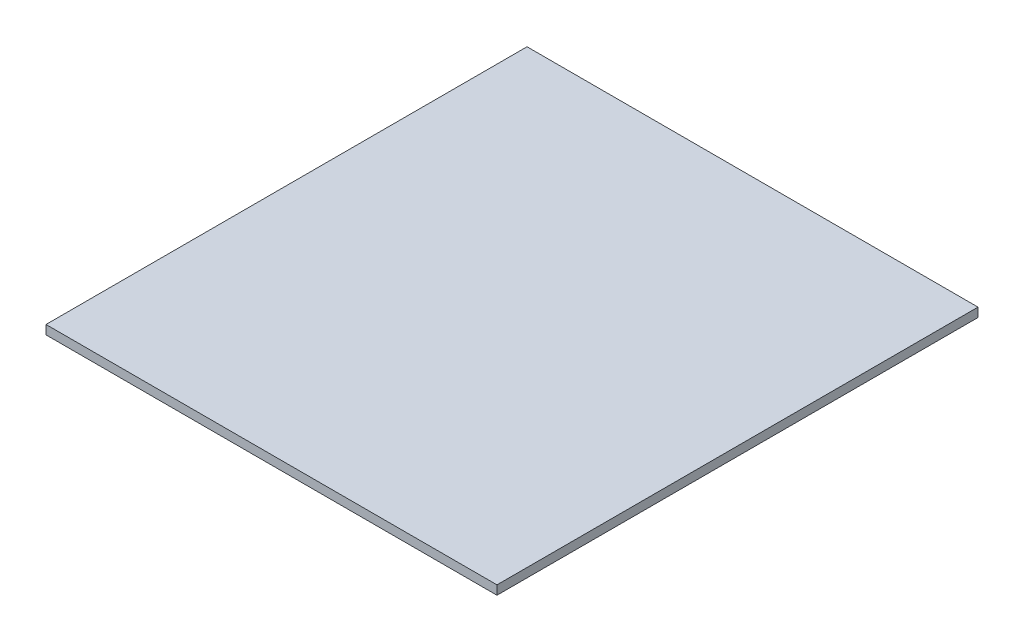
ISO-10303-21;
HEADER;
FILE_DESCRIPTION(('STEP AP214'),'2;1');
FILE_NAME('part.step','',(''),(''),'','','');
FILE_SCHEMA(('AUTOMOTIVE_DESIGN { 1 0 10303 214 1 1 1 1 }'));
ENDSEC;
DATA;
#1=APPLICATION_CONTEXT('core data for automotive mechanical design processes');
#2=APPLICATION_PROTOCOL_DEFINITION('international standard','automotive_design',2000,#1);
#3=PRODUCT_CONTEXT('',#1,'mechanical');
#4=PRODUCT('Part','Part','',(#3));
#5=PRODUCT_RELATED_PRODUCT_CATEGORY('part','',(#4));
#6=PRODUCT_DEFINITION_FORMATION('','',#4);
#7=PRODUCT_DEFINITION_CONTEXT('part definition',#1,'design');
#8=PRODUCT_DEFINITION('design','',#6,#7);
#9=PRODUCT_DEFINITION_SHAPE('','',#8);
#10=(LENGTH_UNIT() NAMED_UNIT(*) SI_UNIT(.MILLI.,.METRE.));
#11=(NAMED_UNIT(*) PLANE_ANGLE_UNIT() SI_UNIT($,.RADIAN.));
#12=(NAMED_UNIT(*) SI_UNIT($,.STERADIAN.) SOLID_ANGLE_UNIT());
#13=UNCERTAINTY_MEASURE_WITH_UNIT(LENGTH_MEASURE(1.E-05),#10,'distance_accuracy_value','');
#14=(GEOMETRIC_REPRESENTATION_CONTEXT(3) GLOBAL_UNCERTAINTY_ASSIGNED_CONTEXT((#13)) GLOBAL_UNIT_ASSIGNED_CONTEXT((#10,
#11,#12)) REPRESENTATION_CONTEXT('',''));
#15=CARTESIAN_POINT('',(0.,0.,0.));
#16=DIRECTION('',(0.,0.,1.));
#17=DIRECTION('',(1.,0.,0.));
#18=AXIS2_PLACEMENT_3D('',#15,#16,#17);
#19=CARTESIAN_POINT('',(75.,3.,80.));
#20=DIRECTION('',(-1.,0.,0.));
#21=DIRECTION('',(0.,0.,1.));
#22=AXIS2_PLACEMENT_3D('',#19,#20,#21);
#23=PLANE('',#22);
#24=DIRECTION('',(0.,0.,-1.));
#25=VECTOR('',#24,1.);
#26=CARTESIAN_POINT('',(75.,0.,80.));
#27=LINE('',#26,#25);
#28=CARTESIAN_POINT('',(75.,0.,80.));
#29=VERTEX_POINT('',#28);
#30=CARTESIAN_POINT('',(75.,0.,-80.));
#31=VERTEX_POINT('',#30);
#32=EDGE_CURVE('E98',#29,#31,#27,.T.);
#33=ORIENTED_EDGE('',*,*,#32,.T.);
#34=DIRECTION('',(0.,-1.,0.));
#35=VECTOR('',#34,1.);
#36=CARTESIAN_POINT('',(75.,3.,-80.));
#37=LINE('',#36,#35);
#38=CARTESIAN_POINT('',(75.,3.,-80.));
#39=VERTEX_POINT('',#38);
#40=EDGE_CURVE('E11',#39,#31,#37,.T.);
#41=ORIENTED_EDGE('',*,*,#40,.F.);
#42=DIRECTION('',(0.,0.,-1.));
#43=VECTOR('',#42,1.);
#44=CARTESIAN_POINT('',(75.,3.,80.));
#45=LINE('',#44,#43);
#46=CARTESIAN_POINT('',(75.,3.,80.));
#47=VERTEX_POINT('',#46);
#48=EDGE_CURVE('E86',#47,#39,#45,.T.);
#49=ORIENTED_EDGE('',*,*,#48,.F.);
#50=DIRECTION('',(0.,-1.,0.));
#51=VECTOR('',#50,1.);
#52=CARTESIAN_POINT('',(75.,3.,80.));
#53=LINE('',#52,#51);
#54=EDGE_CURVE('E94',#47,#29,#53,.T.);
#55=ORIENTED_EDGE('',*,*,#54,.T.);
#56=EDGE_LOOP('',(#33,#41,#49,#55));
#57=FACE_BOUND('',#56,.T.);
#58=ADVANCED_FACE('F35',(#57),#23,.F.);
#59=CARTESIAN_POINT('',(-75.,3.,-80.));
#60=DIRECTION('',(0.,0.,1.));
#61=DIRECTION('',(1.,0.,0.));
#62=AXIS2_PLACEMENT_3D('',#59,#60,#61);
#63=PLANE('',#62);
#64=DIRECTION('',(-1.,0.,0.));
#65=VECTOR('',#64,1.);
#66=CARTESIAN_POINT('',(-75.,0.,-80.));
#67=LINE('',#66,#65);
#68=CARTESIAN_POINT('',(-75.,0.,-80.));
#69=VERTEX_POINT('',#68);
#70=EDGE_CURVE('E90',#31,#69,#67,.T.);
#71=ORIENTED_EDGE('',*,*,#70,.T.);
#72=DIRECTION('',(0.,-1.,0.));
#73=VECTOR('',#72,1.);
#74=CARTESIAN_POINT('',(-75.,3.,-80.));
#75=LINE('',#74,#73);
#76=CARTESIAN_POINT('',(-75.,3.,-80.));
#77=VERTEX_POINT('',#76);
#78=EDGE_CURVE('E43',#77,#69,#75,.T.);
#79=ORIENTED_EDGE('',*,*,#78,.F.);
#80=DIRECTION('',(-1.,0.,0.));
#81=VECTOR('',#80,1.);
#82=CARTESIAN_POINT('',(-75.,3.,-80.));
#83=LINE('',#82,#81);
#84=EDGE_CURVE('E81',#39,#77,#83,.T.);
#85=ORIENTED_EDGE('',*,*,#84,.F.);
#86=ORIENTED_EDGE('',*,*,#40,.T.);
#87=EDGE_LOOP('',(#71,#79,#85,#86));
#88=FACE_BOUND('',#87,.T.);
#89=ADVANCED_FACE('F89',(#88),#63,.F.);
#90=CARTESIAN_POINT('',(-75.,3.,80.));
#91=DIRECTION('',(1.,0.,0.));
#92=DIRECTION('',(0.,0.,-1.));
#93=AXIS2_PLACEMENT_3D('',#90,#91,#92);
#94=PLANE('',#93);
#95=DIRECTION('',(0.,0.,1.));
#96=VECTOR('',#95,1.);
#97=CARTESIAN_POINT('',(-75.,0.,80.));
#98=LINE('',#97,#96);
#99=CARTESIAN_POINT('',(-75.,0.,80.));
#100=VERTEX_POINT('',#99);
#101=EDGE_CURVE('E68',#69,#100,#98,.T.);
#102=ORIENTED_EDGE('',*,*,#101,.T.);
#103=DIRECTION('',(0.,-1.,0.));
#104=VECTOR('',#103,1.);
#105=CARTESIAN_POINT('',(-75.,3.,80.));
#106=LINE('',#105,#104);
#107=CARTESIAN_POINT('',(-75.,3.,80.));
#108=VERTEX_POINT('',#107);
#109=EDGE_CURVE('E91',#108,#100,#106,.T.);
#110=ORIENTED_EDGE('',*,*,#109,.F.);
#111=DIRECTION('',(0.,0.,1.));
#112=VECTOR('',#111,1.);
#113=CARTESIAN_POINT('',(-75.,3.,80.));
#114=LINE('',#113,#112);
#115=EDGE_CURVE('E84',#77,#108,#114,.T.);
#116=ORIENTED_EDGE('',*,*,#115,.F.);
#117=ORIENTED_EDGE('',*,*,#78,.T.);
#118=EDGE_LOOP('',(#102,#110,#116,#117));
#119=FACE_BOUND('',#118,.T.);
#120=ADVANCED_FACE('F92',(#119),#94,.F.);
#121=CARTESIAN_POINT('',(-75.,3.,80.));
#122=DIRECTION('',(0.,0.,-1.));
#123=DIRECTION('',(-1.,0.,0.));
#124=AXIS2_PLACEMENT_3D('',#121,#122,#123);
#125=PLANE('',#124);
#126=DIRECTION('',(1.,0.,0.));
#127=VECTOR('',#126,1.);
#128=CARTESIAN_POINT('',(-75.,0.,80.));
#129=LINE('',#128,#127);
#130=EDGE_CURVE('E74',#100,#29,#129,.T.);
#131=ORIENTED_EDGE('',*,*,#130,.T.);
#132=ORIENTED_EDGE('',*,*,#54,.F.);
#133=DIRECTION('',(1.,0.,0.));
#134=VECTOR('',#133,1.);
#135=CARTESIAN_POINT('',(-75.,3.,80.));
#136=LINE('',#135,#134);
#137=EDGE_CURVE('E51',#108,#47,#136,.T.);
#138=ORIENTED_EDGE('',*,*,#137,.F.);
#139=ORIENTED_EDGE('',*,*,#109,.T.);
#140=EDGE_LOOP('',(#131,#132,#138,#139));
#141=FACE_BOUND('',#140,.T.);
#142=ADVANCED_FACE('F105',(#141),#125,.F.);
#143=CARTESIAN_POINT('',(0.,3.,0.));
#144=DIRECTION('',(0.,-1.,0.));
#145=DIRECTION('',(0.,0.,-1.));
#146=AXIS2_PLACEMENT_3D('',#143,#144,#145);
#147=PLANE('',#146);
#148=ORIENTED_EDGE('',*,*,#48,.T.);
#149=ORIENTED_EDGE('',*,*,#84,.T.);
#150=ORIENTED_EDGE('',*,*,#115,.T.);
#151=ORIENTED_EDGE('',*,*,#137,.T.);
#152=EDGE_LOOP('',(#148,#149,#150,#151));
#153=FACE_BOUND('',#152,.T.);
#154=ADVANCED_FACE('F82',(#153),#147,.F.);
#155=CARTESIAN_POINT('',(0.,0.,0.));
#156=DIRECTION('',(0.,-1.,0.));
#157=DIRECTION('',(0.,0.,-1.));
#158=AXIS2_PLACEMENT_3D('',#155,#156,#157);
#159=PLANE('',#158);
#160=ORIENTED_EDGE('',*,*,#32,.F.);
#161=ORIENTED_EDGE('',*,*,#130,.F.);
#162=ORIENTED_EDGE('',*,*,#101,.F.);
#163=ORIENTED_EDGE('',*,*,#70,.F.);
#164=EDGE_LOOP('',(#160,#161,#162,#163));
#165=FACE_BOUND('',#164,.T.);
#166=ADVANCED_FACE('F108',(#165),#159,.T.);
#167=CLOSED_SHELL('',(#58,#89,#120,#142,#154,#166));
#168=MANIFOLD_SOLID_BREP('B2',#167);
#169=ADVANCED_BREP_SHAPE_REPRESENTATION('',(#18,#168),#14);
#170=SHAPE_DEFINITION_REPRESENTATION(#9,#169);
ENDSEC;
END-ISO-10303-21;
